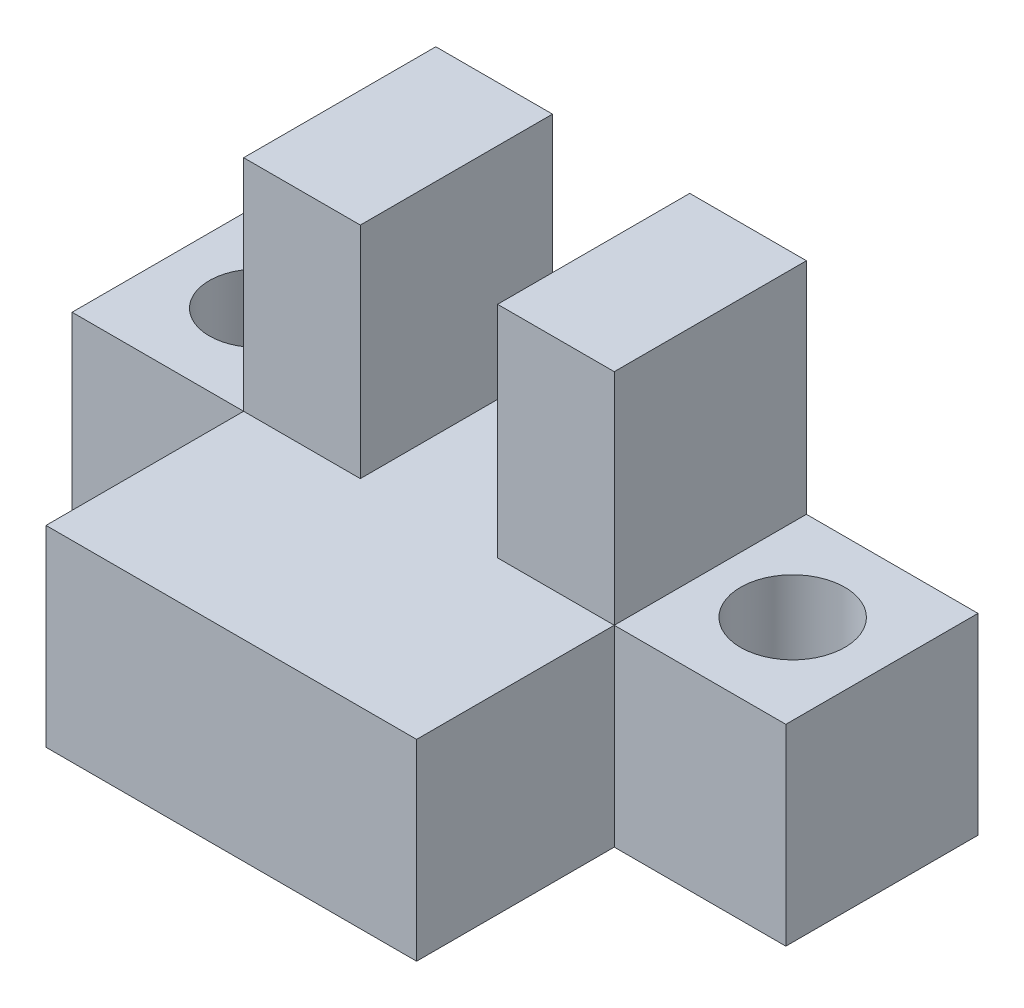
ISO-10303-21;
HEADER;
FILE_DESCRIPTION(('STEP AP214'),'2;1');
FILE_NAME('part.step','',(''),(''),'','','');
FILE_SCHEMA(('AUTOMOTIVE_DESIGN { 1 0 10303 214 1 1 1 1 }'));
ENDSEC;
DATA;
#1=APPLICATION_CONTEXT('core data for automotive mechanical design processes');
#2=APPLICATION_PROTOCOL_DEFINITION('international standard','automotive_design',2000,#1);
#3=PRODUCT_CONTEXT('',#1,'mechanical');
#4=PRODUCT('Part','Part','',(#3));
#5=PRODUCT_RELATED_PRODUCT_CATEGORY('part','',(#4));
#6=PRODUCT_DEFINITION_FORMATION('','',#4);
#7=PRODUCT_DEFINITION_CONTEXT('part definition',#1,'design');
#8=PRODUCT_DEFINITION('design','',#6,#7);
#9=PRODUCT_DEFINITION_SHAPE('','',#8);
#10=(LENGTH_UNIT() NAMED_UNIT(*) SI_UNIT(.MILLI.,.METRE.));
#11=(NAMED_UNIT(*) PLANE_ANGLE_UNIT() SI_UNIT($,.RADIAN.));
#12=(NAMED_UNIT(*) SI_UNIT($,.STERADIAN.) SOLID_ANGLE_UNIT());
#13=UNCERTAINTY_MEASURE_WITH_UNIT(LENGTH_MEASURE(1.E-05),#10,'distance_accuracy_value','');
#14=(GEOMETRIC_REPRESENTATION_CONTEXT(3) GLOBAL_UNCERTAINTY_ASSIGNED_CONTEXT((#13)) GLOBAL_UNIT_ASSIGNED_CONTEXT((#10,
#11,#12)) REPRESENTATION_CONTEXT('',''));
#15=CARTESIAN_POINT('',(0.,0.,0.));
#16=DIRECTION('',(0.,0.,1.));
#17=DIRECTION('',(1.,0.,0.));
#18=AXIS2_PLACEMENT_3D('',#15,#16,#17);
#19=CARTESIAN_POINT('',(0.,7.,0.));
#20=DIRECTION('',(0.,-1.,0.));
#21=DIRECTION('',(0.,0.,-1.));
#22=AXIS2_PLACEMENT_3D('',#19,#20,#21);
#23=PLANE('',#22);
#24=DIRECTION('',(0.,0.,1.));
#25=VECTOR('',#24,1.);
#26=CARTESIAN_POINT('',(15.5,7.,-14.2));
#27=LINE('',#26,#25);
#28=CARTESIAN_POINT('',(15.5,7.,-14.2));
#29=VERTEX_POINT('',#28);
#30=CARTESIAN_POINT('',(15.5,7.,-7.2));
#31=VERTEX_POINT('',#30);
#32=EDGE_CURVE('E168',#29,#31,#27,.T.);
#33=ORIENTED_EDGE('',*,*,#32,.F.);
#34=DIRECTION('',(-1.,0.,0.));
#35=VECTOR('',#34,1.);
#36=CARTESIAN_POINT('',(0.,7.,-14.2));
#37=LINE('',#36,#35);
#38=CARTESIAN_POINT('',(10.5,7.,-14.2));
#39=VERTEX_POINT('',#38);
#40=EDGE_CURVE('E211',#29,#39,#37,.T.);
#41=ORIENTED_EDGE('',*,*,#40,.T.);
#42=DIRECTION('',(0.,0.,-1.));
#43=VECTOR('',#42,1.);
#44=CARTESIAN_POINT('',(10.5,7.,-14.2));
#45=LINE('',#44,#43);
#46=CARTESIAN_POINT('',(10.5,7.,-7.2));
#47=VERTEX_POINT('',#46);
#48=EDGE_CURVE('E182',#47,#39,#45,.T.);
#49=ORIENTED_EDGE('',*,*,#48,.F.);
#50=DIRECTION('',(1.,0.,0.));
#51=VECTOR('',#50,1.);
#52=CARTESIAN_POINT('',(6.25,7.,-7.2));
#53=LINE('',#52,#51);
#54=CARTESIAN_POINT('',(6.25,7.,-7.2));
#55=VERTEX_POINT('',#54);
#56=EDGE_CURVE('E172',#55,#47,#53,.T.);
#57=ORIENTED_EDGE('',*,*,#56,.F.);
#58=DIRECTION('',(0.,0.,1.));
#59=VECTOR('',#58,1.);
#60=CARTESIAN_POINT('',(6.25,7.,0.));
#61=LINE('',#60,#59);
#62=CARTESIAN_POINT('',(6.25,7.,0.));
#63=VERTEX_POINT('',#62);
#64=EDGE_CURVE('E216',#55,#63,#61,.T.);
#65=ORIENTED_EDGE('',*,*,#64,.T.);
#66=DIRECTION('',(1.,0.,0.));
#67=VECTOR('',#66,1.);
#68=CARTESIAN_POINT('',(6.25,7.,0.));
#69=LINE('',#68,#67);
#70=CARTESIAN_POINT('',(19.75,7.,0.));
#71=VERTEX_POINT('',#70);
#72=EDGE_CURVE('E218',#63,#71,#69,.T.);
#73=ORIENTED_EDGE('',*,*,#72,.T.);
#74=DIRECTION('',(0.,0.,-1.));
#75=VECTOR('',#74,1.);
#76=CARTESIAN_POINT('',(19.75,7.,0.));
#77=LINE('',#76,#75);
#78=CARTESIAN_POINT('',(19.75,7.,-7.2));
#79=VERTEX_POINT('',#78);
#80=EDGE_CURVE('E220',#71,#79,#77,.T.);
#81=ORIENTED_EDGE('',*,*,#80,.T.);
#82=DIRECTION('',(1.,0.,0.));
#83=VECTOR('',#82,1.);
#84=CARTESIAN_POINT('',(15.5,7.,-7.2));
#85=LINE('',#84,#83);
#86=EDGE_CURVE('E52',#31,#79,#85,.T.);
#87=ORIENTED_EDGE('',*,*,#86,.F.);
#88=EDGE_LOOP('',(#33,#41,#49,#57,#65,#73,#81,#87));
#89=FACE_BOUND('',#88,.T.);
#90=ADVANCED_FACE('F35',(#89),#23,.F.);
#91=CARTESIAN_POINT('',(22.75,7.,-10.7));
#92=DIRECTION('',(0.,1.,0.));
#93=DIRECTION('',(0.,0.,1.));
#94=AXIS2_PLACEMENT_3D('',#91,#92,#93);
#95=CIRCLE('',#94,1.89947846464492);
#96=CARTESIAN_POINT('',(22.75,7.,-8.80052153535508));
#97=VERTEX_POINT('',#96);
#98=EDGE_CURVE('E265',#97,#97,#95,.T.);
#99=ORIENTED_EDGE('',*,*,#98,.F.);
#100=EDGE_LOOP('',(#99));
#101=FACE_BOUND('',#100,.T.);
#102=DIRECTION('',(0.,0.,-1.));
#103=VECTOR('',#102,1.);
#104=CARTESIAN_POINT('',(19.75,7.,-14.2));
#105=LINE('',#104,#103);
#106=CARTESIAN_POINT('',(19.75,7.,-14.2));
#107=VERTEX_POINT('',#106);
#108=EDGE_CURVE('E165',#79,#107,#105,.T.);
#109=ORIENTED_EDGE('',*,*,#108,.F.);
#110=DIRECTION('',(1.,0.,0.));
#111=VECTOR('',#110,1.);
#112=CARTESIAN_POINT('',(19.75,7.,-7.2));
#113=LINE('',#112,#111);
#114=CARTESIAN_POINT('',(26.,7.,-7.2));
#115=VERTEX_POINT('',#114);
#116=EDGE_CURVE('E222',#79,#115,#113,.T.);
#117=ORIENTED_EDGE('',*,*,#116,.T.);
#118=DIRECTION('',(0.,0.,-1.));
#119=VECTOR('',#118,1.);
#120=CARTESIAN_POINT('',(26.,7.,-7.2));
#121=LINE('',#120,#119);
#122=CARTESIAN_POINT('',(26.,7.,-14.2));
#123=VERTEX_POINT('',#122);
#124=EDGE_CURVE('E205',#115,#123,#121,.T.);
#125=ORIENTED_EDGE('',*,*,#124,.T.);
#126=EDGE_CURVE('E60',#123,#107,#37,.T.);
#127=ORIENTED_EDGE('',*,*,#126,.T.);
#128=EDGE_LOOP('',(#109,#117,#125,#127));
#129=FACE_BOUND('',#128,.T.);
#130=ADVANCED_FACE('F284',(#101,#129),#23,.F.);
#131=CARTESIAN_POINT('',(3.25,7.,-10.7));
#132=DIRECTION('',(0.,1.,0.));
#133=DIRECTION('',(0.,0.,1.));
#134=AXIS2_PLACEMENT_3D('',#131,#132,#133);
#135=CIRCLE('',#134,1.75);
#136=CARTESIAN_POINT('',(3.25,7.,-8.95));
#137=VERTEX_POINT('',#136);
#138=EDGE_CURVE('E260',#137,#137,#135,.T.);
#139=ORIENTED_EDGE('',*,*,#138,.F.);
#140=EDGE_LOOP('',(#139));
#141=FACE_BOUND('',#140,.T.);
#142=DIRECTION('',(0.,0.,1.));
#143=VECTOR('',#142,1.);
#144=CARTESIAN_POINT('',(6.25,7.,-14.2));
#145=LINE('',#144,#143);
#146=CARTESIAN_POINT('',(6.25,7.,-14.2));
#147=VERTEX_POINT('',#146);
#148=EDGE_CURVE('E169',#147,#55,#145,.T.);
#149=ORIENTED_EDGE('',*,*,#148,.F.);
#150=CARTESIAN_POINT('',(0.,7.,-14.2));
#151=VERTEX_POINT('',#150);
#152=EDGE_CURVE('E207',#147,#151,#37,.T.);
#153=ORIENTED_EDGE('',*,*,#152,.T.);
#154=DIRECTION('',(0.,0.,1.));
#155=VECTOR('',#154,1.);
#156=CARTESIAN_POINT('',(0.,7.,-7.2));
#157=LINE('',#156,#155);
#158=CARTESIAN_POINT('',(0.,7.,-7.2));
#159=VERTEX_POINT('',#158);
#160=EDGE_CURVE('E210',#151,#159,#157,.T.);
#161=ORIENTED_EDGE('',*,*,#160,.T.);
#162=DIRECTION('',(1.,0.,0.));
#163=VECTOR('',#162,1.);
#164=CARTESIAN_POINT('',(0.,7.,-7.2));
#165=LINE('',#164,#163);
#166=EDGE_CURVE('E213',#159,#55,#165,.T.);
#167=ORIENTED_EDGE('',*,*,#166,.T.);
#168=EDGE_LOOP('',(#149,#153,#161,#167));
#169=FACE_BOUND('',#168,.T.);
#170=ADVANCED_FACE('F330',(#141,#169),#23,.F.);
#171=CARTESIAN_POINT('',(26.,7.,-7.2));
#172=DIRECTION('',(-1.,0.,0.));
#173=DIRECTION('',(0.,0.,1.));
#174=AXIS2_PLACEMENT_3D('',#171,#172,#173);
#175=PLANE('',#174);
#176=DIRECTION('',(0.,0.,-1.));
#177=VECTOR('',#176,1.);
#178=CARTESIAN_POINT('',(26.,0.,-7.2));
#179=LINE('',#178,#177);
#180=CARTESIAN_POINT('',(26.,0.,-7.2));
#181=VERTEX_POINT('',#180);
#182=CARTESIAN_POINT('',(26.,0.,-14.2));
#183=VERTEX_POINT('',#182);
#184=EDGE_CURVE('E204',#181,#183,#179,.T.);
#185=ORIENTED_EDGE('',*,*,#184,.T.);
#186=DIRECTION('',(0.,-1.,0.));
#187=VECTOR('',#186,1.);
#188=CARTESIAN_POINT('',(26.,7.,-14.2));
#189=LINE('',#188,#187);
#190=EDGE_CURVE('E11',#123,#183,#189,.T.);
#191=ORIENTED_EDGE('',*,*,#190,.F.);
#192=ORIENTED_EDGE('',*,*,#124,.F.);
#193=DIRECTION('',(0.,-1.,0.));
#194=VECTOR('',#193,1.);
#195=CARTESIAN_POINT('',(26.,7.,-7.2));
#196=LINE('',#195,#194);
#197=EDGE_CURVE('E224',#115,#181,#196,.T.);
#198=ORIENTED_EDGE('',*,*,#197,.T.);
#199=EDGE_LOOP('',(#185,#191,#192,#198));
#200=FACE_BOUND('',#199,.T.);
#201=ADVANCED_FACE('F37',(#200),#175,.F.);
#202=CARTESIAN_POINT('',(0.,7.,-14.2));
#203=DIRECTION('',(0.,0.,1.));
#204=DIRECTION('',(1.,0.,0.));
#205=AXIS2_PLACEMENT_3D('',#202,#203,#204);
#206=PLANE('',#205);
#207=DIRECTION('',(-1.,0.,0.));
#208=VECTOR('',#207,1.);
#209=CARTESIAN_POINT('',(0.,0.,-14.2));
#210=LINE('',#209,#208);
#211=CARTESIAN_POINT('',(0.,0.,-14.2));
#212=VERTEX_POINT('',#211);
#213=EDGE_CURVE('E227',#183,#212,#210,.T.);
#214=ORIENTED_EDGE('',*,*,#213,.T.);
#215=DIRECTION('',(0.,-1.,0.));
#216=VECTOR('',#215,1.);
#217=CARTESIAN_POINT('',(0.,7.,-14.2));
#218=LINE('',#217,#216);
#219=EDGE_CURVE('E44',#151,#212,#218,.T.);
#220=ORIENTED_EDGE('',*,*,#219,.F.);
#221=ORIENTED_EDGE('',*,*,#152,.F.);
#222=DIRECTION('',(0.,-1.,0.));
#223=VECTOR('',#222,1.);
#224=CARTESIAN_POINT('',(6.25,15.,-14.2));
#225=LINE('',#224,#223);
#226=CARTESIAN_POINT('',(6.25,15.,-14.2));
#227=VERTEX_POINT('',#226);
#228=EDGE_CURVE('E187',#227,#147,#225,.T.);
#229=ORIENTED_EDGE('',*,*,#228,.F.);
#230=DIRECTION('',(-1.,0.,0.));
#231=VECTOR('',#230,1.);
#232=CARTESIAN_POINT('',(6.25,15.,-14.2));
#233=LINE('',#232,#231);
#234=CARTESIAN_POINT('',(10.5,15.,-14.2));
#235=VERTEX_POINT('',#234);
#236=EDGE_CURVE('E186',#235,#227,#233,.T.);
#237=ORIENTED_EDGE('',*,*,#236,.F.);
#238=DIRECTION('',(0.,-1.,0.));
#239=VECTOR('',#238,1.);
#240=CARTESIAN_POINT('',(10.5,15.,-14.2));
#241=LINE('',#240,#239);
#242=EDGE_CURVE('E195',#235,#39,#241,.T.);
#243=ORIENTED_EDGE('',*,*,#242,.T.);
#244=ORIENTED_EDGE('',*,*,#40,.F.);
#245=DIRECTION('',(0.,-1.,0.));
#246=VECTOR('',#245,1.);
#247=CARTESIAN_POINT('',(15.5,15.,-14.2));
#248=LINE('',#247,#246);
#249=CARTESIAN_POINT('',(15.5,15.,-14.2));
#250=VERTEX_POINT('',#249);
#251=EDGE_CURVE('E274',#250,#29,#248,.T.);
#252=ORIENTED_EDGE('',*,*,#251,.F.);
#253=DIRECTION('',(-1.,0.,0.));
#254=VECTOR('',#253,1.);
#255=CARTESIAN_POINT('',(15.5,15.,-14.2));
#256=LINE('',#255,#254);
#257=CARTESIAN_POINT('',(19.75,15.,-14.2));
#258=VERTEX_POINT('',#257);
#259=EDGE_CURVE('E161',#258,#250,#256,.T.);
#260=ORIENTED_EDGE('',*,*,#259,.F.);
#261=DIRECTION('',(0.,-1.,0.));
#262=VECTOR('',#261,1.);
#263=CARTESIAN_POINT('',(19.75,15.,-14.2));
#264=LINE('',#263,#262);
#265=EDGE_CURVE('E174',#258,#107,#264,.T.);
#266=ORIENTED_EDGE('',*,*,#265,.T.);
#267=ORIENTED_EDGE('',*,*,#126,.F.);
#268=ORIENTED_EDGE('',*,*,#190,.T.);
#269=EDGE_LOOP('',(#214,#220,#221,#229,#237,#243,#244,#252,#260,#266,#267,#268));
#270=FACE_BOUND('',#269,.T.);
#271=ADVANCED_FACE('F281',(#270),#206,.F.);
#272=CARTESIAN_POINT('',(0.,7.,-7.2));
#273=DIRECTION('',(1.,0.,0.));
#274=DIRECTION('',(0.,0.,-1.));
#275=AXIS2_PLACEMENT_3D('',#272,#273,#274);
#276=PLANE('',#275);
#277=DIRECTION('',(0.,0.,1.));
#278=VECTOR('',#277,1.);
#279=CARTESIAN_POINT('',(0.,0.,-7.2));
#280=LINE('',#279,#278);
#281=CARTESIAN_POINT('',(0.,0.,-7.2));
#282=VERTEX_POINT('',#281);
#283=EDGE_CURVE('E229',#212,#282,#280,.T.);
#284=ORIENTED_EDGE('',*,*,#283,.T.);
#285=DIRECTION('',(0.,-1.,0.));
#286=VECTOR('',#285,1.);
#287=CARTESIAN_POINT('',(0.,7.,-7.2));
#288=LINE('',#287,#286);
#289=EDGE_CURVE('E254',#159,#282,#288,.T.);
#290=ORIENTED_EDGE('',*,*,#289,.F.);
#291=ORIENTED_EDGE('',*,*,#160,.F.);
#292=ORIENTED_EDGE('',*,*,#219,.T.);
#293=EDGE_LOOP('',(#284,#290,#291,#292));
#294=FACE_BOUND('',#293,.T.);
#295=ADVANCED_FACE('F307',(#294),#276,.F.);
#296=CARTESIAN_POINT('',(0.,7.,-7.2));
#297=DIRECTION('',(0.,0.,-1.));
#298=DIRECTION('',(-1.,0.,0.));
#299=AXIS2_PLACEMENT_3D('',#296,#297,#298);
#300=PLANE('',#299);
#301=DIRECTION('',(1.,0.,0.));
#302=VECTOR('',#301,1.);
#303=CARTESIAN_POINT('',(0.,0.,-7.2));
#304=LINE('',#303,#302);
#305=CARTESIAN_POINT('',(6.25,0.,-7.2));
#306=VERTEX_POINT('',#305);
#307=EDGE_CURVE('E231',#282,#306,#304,.T.);
#308=ORIENTED_EDGE('',*,*,#307,.T.);
#309=DIRECTION('',(0.,-1.,0.));
#310=VECTOR('',#309,1.);
#311=CARTESIAN_POINT('',(6.25,7.,-7.2));
#312=LINE('',#311,#310);
#313=EDGE_CURVE('E251',#55,#306,#312,.T.);
#314=ORIENTED_EDGE('',*,*,#313,.F.);
#315=ORIENTED_EDGE('',*,*,#166,.F.);
#316=ORIENTED_EDGE('',*,*,#289,.T.);
#317=EDGE_LOOP('',(#308,#314,#315,#316));
#318=FACE_BOUND('',#317,.T.);
#319=ADVANCED_FACE('F315',(#318),#300,.F.);
#320=CARTESIAN_POINT('',(6.25,7.,0.));
#321=DIRECTION('',(1.,0.,0.));
#322=DIRECTION('',(0.,0.,-1.));
#323=AXIS2_PLACEMENT_3D('',#320,#321,#322);
#324=PLANE('',#323);
#325=DIRECTION('',(0.,0.,1.));
#326=VECTOR('',#325,1.);
#327=CARTESIAN_POINT('',(6.25,0.,0.));
#328=LINE('',#327,#326);
#329=CARTESIAN_POINT('',(6.25,0.,0.));
#330=VERTEX_POINT('',#329);
#331=EDGE_CURVE('E233',#306,#330,#328,.T.);
#332=ORIENTED_EDGE('',*,*,#331,.T.);
#333=DIRECTION('',(0.,-1.,0.));
#334=VECTOR('',#333,1.);
#335=CARTESIAN_POINT('',(6.25,7.,0.));
#336=LINE('',#335,#334);
#337=EDGE_CURVE('E248',#63,#330,#336,.T.);
#338=ORIENTED_EDGE('',*,*,#337,.F.);
#339=ORIENTED_EDGE('',*,*,#64,.F.);
#340=ORIENTED_EDGE('',*,*,#313,.T.);
#341=EDGE_LOOP('',(#332,#338,#339,#340));
#342=FACE_BOUND('',#341,.T.);
#343=ADVANCED_FACE('F319',(#342),#324,.F.);
#344=CARTESIAN_POINT('',(6.25,7.,0.));
#345=DIRECTION('',(0.,0.,-1.));
#346=DIRECTION('',(-1.,0.,0.));
#347=AXIS2_PLACEMENT_3D('',#344,#345,#346);
#348=PLANE('',#347);
#349=DIRECTION('',(1.,0.,0.));
#350=VECTOR('',#349,1.);
#351=CARTESIAN_POINT('',(6.25,0.,0.));
#352=LINE('',#351,#350);
#353=CARTESIAN_POINT('',(19.75,0.,0.));
#354=VERTEX_POINT('',#353);
#355=EDGE_CURVE('E235',#330,#354,#352,.T.);
#356=ORIENTED_EDGE('',*,*,#355,.T.);
#357=DIRECTION('',(0.,-1.,0.));
#358=VECTOR('',#357,1.);
#359=CARTESIAN_POINT('',(19.75,7.,0.));
#360=LINE('',#359,#358);
#361=EDGE_CURVE('E245',#71,#354,#360,.T.);
#362=ORIENTED_EDGE('',*,*,#361,.F.);
#363=ORIENTED_EDGE('',*,*,#72,.F.);
#364=ORIENTED_EDGE('',*,*,#337,.T.);
#365=EDGE_LOOP('',(#356,#362,#363,#364));
#366=FACE_BOUND('',#365,.T.);
#367=ADVANCED_FACE('F371',(#366),#348,.F.);
#368=CARTESIAN_POINT('',(19.75,7.,0.));
#369=DIRECTION('',(-1.,0.,0.));
#370=DIRECTION('',(0.,0.,1.));
#371=AXIS2_PLACEMENT_3D('',#368,#369,#370);
#372=PLANE('',#371);
#373=DIRECTION('',(0.,0.,-1.));
#374=VECTOR('',#373,1.);
#375=CARTESIAN_POINT('',(19.75,0.,0.));
#376=LINE('',#375,#374);
#377=CARTESIAN_POINT('',(19.75,0.,-7.2));
#378=VERTEX_POINT('',#377);
#379=EDGE_CURVE('E237',#354,#378,#376,.T.);
#380=ORIENTED_EDGE('',*,*,#379,.T.);
#381=DIRECTION('',(0.,-1.,0.));
#382=VECTOR('',#381,1.);
#383=CARTESIAN_POINT('',(19.75,7.,-7.2));
#384=LINE('',#383,#382);
#385=EDGE_CURVE('E242',#79,#378,#384,.T.);
#386=ORIENTED_EDGE('',*,*,#385,.F.);
#387=ORIENTED_EDGE('',*,*,#80,.F.);
#388=ORIENTED_EDGE('',*,*,#361,.T.);
#389=EDGE_LOOP('',(#380,#386,#387,#388));
#390=FACE_BOUND('',#389,.T.);
#391=ADVANCED_FACE('F292',(#390),#372,.F.);
#392=CARTESIAN_POINT('',(19.75,7.,-7.2));
#393=DIRECTION('',(0.,0.,-1.));
#394=DIRECTION('',(-1.,0.,0.));
#395=AXIS2_PLACEMENT_3D('',#392,#393,#394);
#396=PLANE('',#395);
#397=DIRECTION('',(1.,0.,0.));
#398=VECTOR('',#397,1.);
#399=CARTESIAN_POINT('',(19.75,0.,-7.2));
#400=LINE('',#399,#398);
#401=EDGE_CURVE('E208',#378,#181,#400,.T.);
#402=ORIENTED_EDGE('',*,*,#401,.T.);
#403=ORIENTED_EDGE('',*,*,#197,.F.);
#404=ORIENTED_EDGE('',*,*,#116,.F.);
#405=ORIENTED_EDGE('',*,*,#385,.T.);
#406=EDGE_LOOP('',(#402,#403,#404,#405));
#407=FACE_BOUND('',#406,.T.);
#408=ADVANCED_FACE('F296',(#407),#396,.F.);
#409=CARTESIAN_POINT('',(0.,0.,0.));
#410=DIRECTION('',(0.,-1.,0.));
#411=DIRECTION('',(0.,0.,-1.));
#412=AXIS2_PLACEMENT_3D('',#409,#410,#411);
#413=PLANE('',#412);
#414=CARTESIAN_POINT('',(3.25,0.,-10.7));
#415=DIRECTION('',(0.,-1.,0.));
#416=DIRECTION('',(0.,0.,-1.));
#417=AXIS2_PLACEMENT_3D('',#414,#415,#416);
#418=CIRCLE('',#417,1.75);
#419=CARTESIAN_POINT('',(3.25,0.,-12.45));
#420=VERTEX_POINT('',#419);
#421=EDGE_CURVE('E39',#420,#420,#418,.T.);
#422=ORIENTED_EDGE('',*,*,#421,.F.);
#423=EDGE_LOOP('',(#422));
#424=FACE_BOUND('',#423,.T.);
#425=CARTESIAN_POINT('',(22.75,0.,-10.7));
#426=DIRECTION('',(0.,-1.,0.));
#427=DIRECTION('',(0.,0.,-1.));
#428=AXIS2_PLACEMENT_3D('',#425,#426,#427);
#429=CIRCLE('',#428,1.89947846464492);
#430=CARTESIAN_POINT('',(22.75,0.,-12.5994784646449));
#431=VERTEX_POINT('',#430);
#432=EDGE_CURVE('E258',#431,#431,#429,.T.);
#433=ORIENTED_EDGE('',*,*,#432,.F.);
#434=EDGE_LOOP('',(#433));
#435=FACE_BOUND('',#434,.T.);
#436=ORIENTED_EDGE('',*,*,#184,.F.);
#437=ORIENTED_EDGE('',*,*,#401,.F.);
#438=ORIENTED_EDGE('',*,*,#379,.F.);
#439=ORIENTED_EDGE('',*,*,#355,.F.);
#440=ORIENTED_EDGE('',*,*,#331,.F.);
#441=ORIENTED_EDGE('',*,*,#307,.F.);
#442=ORIENTED_EDGE('',*,*,#283,.F.);
#443=ORIENTED_EDGE('',*,*,#213,.F.);
#444=EDGE_LOOP('',(#436,#437,#438,#439,#440,#441,#442,#443));
#445=FACE_BOUND('',#444,.T.);
#446=ADVANCED_FACE('F310',(#424,#435,#445),#413,.T.);
#447=CARTESIAN_POINT('',(6.25,15.,-14.2));
#448=DIRECTION('',(1.,0.,0.));
#449=DIRECTION('',(0.,0.,-1.));
#450=AXIS2_PLACEMENT_3D('',#447,#448,#449);
#451=PLANE('',#450);
#452=ORIENTED_EDGE('',*,*,#148,.T.);
#453=DIRECTION('',(0.,-1.,0.));
#454=VECTOR('',#453,1.);
#455=CARTESIAN_POINT('',(6.25,15.,-7.2));
#456=LINE('',#455,#454);
#457=CARTESIAN_POINT('',(6.25,15.,-7.2));
#458=VERTEX_POINT('',#457);
#459=EDGE_CURVE('E201',#458,#55,#456,.T.);
#460=ORIENTED_EDGE('',*,*,#459,.F.);
#461=DIRECTION('',(0.,0.,1.));
#462=VECTOR('',#461,1.);
#463=CARTESIAN_POINT('',(6.25,15.,-14.2));
#464=LINE('',#463,#462);
#465=EDGE_CURVE('E178',#227,#458,#464,.T.);
#466=ORIENTED_EDGE('',*,*,#465,.F.);
#467=ORIENTED_EDGE('',*,*,#228,.T.);
#468=EDGE_LOOP('',(#452,#460,#466,#467));
#469=FACE_BOUND('',#468,.T.);
#470=ADVANCED_FACE('F327',(#469),#451,.F.);
#471=CARTESIAN_POINT('',(6.25,15.,-7.2));
#472=DIRECTION('',(0.,0.,-1.));
#473=DIRECTION('',(-1.,0.,0.));
#474=AXIS2_PLACEMENT_3D('',#471,#472,#473);
#475=PLANE('',#474);
#476=ORIENTED_EDGE('',*,*,#56,.T.);
#477=DIRECTION('',(0.,-1.,0.));
#478=VECTOR('',#477,1.);
#479=CARTESIAN_POINT('',(10.5,15.,-7.2));
#480=LINE('',#479,#478);
#481=CARTESIAN_POINT('',(10.5,15.,-7.2));
#482=VERTEX_POINT('',#481);
#483=EDGE_CURVE('E198',#482,#47,#480,.T.);
#484=ORIENTED_EDGE('',*,*,#483,.F.);
#485=DIRECTION('',(1.,0.,0.));
#486=VECTOR('',#485,1.);
#487=CARTESIAN_POINT('',(6.25,15.,-7.2));
#488=LINE('',#487,#486);
#489=EDGE_CURVE('E181',#458,#482,#488,.T.);
#490=ORIENTED_EDGE('',*,*,#489,.F.);
#491=ORIENTED_EDGE('',*,*,#459,.T.);
#492=EDGE_LOOP('',(#476,#484,#490,#491));
#493=FACE_BOUND('',#492,.T.);
#494=ADVANCED_FACE('F323',(#493),#475,.F.);
#495=CARTESIAN_POINT('',(10.5,15.,-14.2));
#496=DIRECTION('',(-1.,0.,0.));
#497=DIRECTION('',(0.,0.,1.));
#498=AXIS2_PLACEMENT_3D('',#495,#496,#497);
#499=PLANE('',#498);
#500=ORIENTED_EDGE('',*,*,#48,.T.);
#501=ORIENTED_EDGE('',*,*,#242,.F.);
#502=DIRECTION('',(0.,0.,-1.));
#503=VECTOR('',#502,1.);
#504=CARTESIAN_POINT('',(10.5,15.,-14.2));
#505=LINE('',#504,#503);
#506=EDGE_CURVE('E184',#482,#235,#505,.T.);
#507=ORIENTED_EDGE('',*,*,#506,.F.);
#508=ORIENTED_EDGE('',*,*,#483,.T.);
#509=EDGE_LOOP('',(#500,#501,#507,#508));
#510=FACE_BOUND('',#509,.T.);
#511=ADVANCED_FACE('F334',(#510),#499,.F.);
#512=CARTESIAN_POINT('',(0.,15.,0.));
#513=DIRECTION('',(0.,1.,0.));
#514=DIRECTION('',(0.,0.,1.));
#515=AXIS2_PLACEMENT_3D('',#512,#513,#514);
#516=PLANE('',#515);
#517=ORIENTED_EDGE('',*,*,#465,.T.);
#518=ORIENTED_EDGE('',*,*,#489,.T.);
#519=ORIENTED_EDGE('',*,*,#506,.T.);
#520=ORIENTED_EDGE('',*,*,#236,.T.);
#521=EDGE_LOOP('',(#517,#518,#519,#520));
#522=FACE_BOUND('',#521,.T.);
#523=ADVANCED_FACE('F337',(#522),#516,.T.);
#524=CARTESIAN_POINT('',(15.5,15.,-14.2));
#525=DIRECTION('',(1.,0.,0.));
#526=DIRECTION('',(0.,0.,-1.));
#527=AXIS2_PLACEMENT_3D('',#524,#525,#526);
#528=PLANE('',#527);
#529=ORIENTED_EDGE('',*,*,#32,.T.);
#530=DIRECTION('',(0.,-1.,0.));
#531=VECTOR('',#530,1.);
#532=CARTESIAN_POINT('',(15.5,15.,-7.2));
#533=LINE('',#532,#531);
#534=CARTESIAN_POINT('',(15.5,15.,-7.2));
#535=VERTEX_POINT('',#534);
#536=EDGE_CURVE('E149',#535,#31,#533,.T.);
#537=ORIENTED_EDGE('',*,*,#536,.F.);
#538=DIRECTION('',(0.,0.,1.));
#539=VECTOR('',#538,1.);
#540=CARTESIAN_POINT('',(15.5,15.,-14.2));
#541=LINE('',#540,#539);
#542=EDGE_CURVE('E156',#250,#535,#541,.T.);
#543=ORIENTED_EDGE('',*,*,#542,.F.);
#544=ORIENTED_EDGE('',*,*,#251,.T.);
#545=EDGE_LOOP('',(#529,#537,#543,#544));
#546=FACE_BOUND('',#545,.T.);
#547=ADVANCED_FACE('F167',(#546),#528,.F.);
#548=CARTESIAN_POINT('',(15.5,15.,-7.2));
#549=DIRECTION('',(0.,0.,-1.));
#550=DIRECTION('',(-1.,0.,0.));
#551=AXIS2_PLACEMENT_3D('',#548,#549,#550);
#552=PLANE('',#551);
#553=ORIENTED_EDGE('',*,*,#86,.T.);
#554=DIRECTION('',(0.,-1.,0.));
#555=VECTOR('',#554,1.);
#556=CARTESIAN_POINT('',(19.75,15.,-7.2));
#557=LINE('',#556,#555);
#558=CARTESIAN_POINT('',(19.75,15.,-7.2));
#559=VERTEX_POINT('',#558);
#560=EDGE_CURVE('E152',#559,#79,#557,.T.);
#561=ORIENTED_EDGE('',*,*,#560,.F.);
#562=DIRECTION('',(1.,0.,0.));
#563=VECTOR('',#562,1.);
#564=CARTESIAN_POINT('',(15.5,15.,-7.2));
#565=LINE('',#564,#563);
#566=EDGE_CURVE('E145',#535,#559,#565,.T.);
#567=ORIENTED_EDGE('',*,*,#566,.F.);
#568=ORIENTED_EDGE('',*,*,#536,.T.);
#569=EDGE_LOOP('',(#553,#561,#567,#568));
#570=FACE_BOUND('',#569,.T.);
#571=ADVANCED_FACE('F147',(#570),#552,.F.);
#572=CARTESIAN_POINT('',(19.75,15.,-14.2));
#573=DIRECTION('',(-1.,0.,0.));
#574=DIRECTION('',(0.,0.,1.));
#575=AXIS2_PLACEMENT_3D('',#572,#573,#574);
#576=PLANE('',#575);
#577=ORIENTED_EDGE('',*,*,#108,.T.);
#578=ORIENTED_EDGE('',*,*,#265,.F.);
#579=DIRECTION('',(0.,0.,-1.));
#580=VECTOR('',#579,1.);
#581=CARTESIAN_POINT('',(19.75,15.,-14.2));
#582=LINE('',#581,#580);
#583=EDGE_CURVE('E155',#559,#258,#582,.T.);
#584=ORIENTED_EDGE('',*,*,#583,.F.);
#585=ORIENTED_EDGE('',*,*,#560,.T.);
#586=EDGE_LOOP('',(#577,#578,#584,#585));
#587=FACE_BOUND('',#586,.T.);
#588=ADVANCED_FACE('F283',(#587),#576,.F.);
#589=CARTESIAN_POINT('',(0.,15.,0.));
#590=DIRECTION('',(0.,1.,0.));
#591=DIRECTION('',(0.,0.,1.));
#592=AXIS2_PLACEMENT_3D('',#589,#590,#591);
#593=PLANE('',#592);
#594=ORIENTED_EDGE('',*,*,#542,.T.);
#595=ORIENTED_EDGE('',*,*,#566,.T.);
#596=ORIENTED_EDGE('',*,*,#583,.T.);
#597=ORIENTED_EDGE('',*,*,#259,.T.);
#598=EDGE_LOOP('',(#594,#595,#596,#597));
#599=FACE_BOUND('',#598,.T.);
#600=ADVANCED_FACE('F159',(#599),#593,.T.);
#601=CARTESIAN_POINT('',(22.75,-12.,-10.7));
#602=DIRECTION('',(0.,1.,0.));
#603=DIRECTION('',(0.,0.,1.));
#604=AXIS2_PLACEMENT_3D('',#601,#602,#603);
#605=CYLINDRICAL_SURFACE('',#604,1.89947846464492);
#606=ORIENTED_EDGE('',*,*,#432,.T.);
#607=EDGE_LOOP('',(#606));
#608=FACE_BOUND('',#607,.T.);
#609=ORIENTED_EDGE('',*,*,#98,.T.);
#610=EDGE_LOOP('',(#609));
#611=FACE_BOUND('',#610,.T.);
#612=ADVANCED_FACE('F388',(#608,#611),#605,.F.);
#613=CARTESIAN_POINT('',(3.25,-12.,-10.7));
#614=DIRECTION('',(0.,1.,0.));
#615=DIRECTION('',(0.,0.,1.));
#616=AXIS2_PLACEMENT_3D('',#613,#614,#615);
#617=CYLINDRICAL_SURFACE('',#616,1.75);
#618=ORIENTED_EDGE('',*,*,#421,.T.);
#619=EDGE_LOOP('',(#618));
#620=FACE_BOUND('',#619,.T.);
#621=ORIENTED_EDGE('',*,*,#138,.T.);
#622=EDGE_LOOP('',(#621));
#623=FACE_BOUND('',#622,.T.);
#624=ADVANCED_FACE('F386',(#620,#623),#617,.F.);
#625=CLOSED_SHELL('',(#90,#130,#170,#201,#271,#295,#319,#343,#367,#391,#408,#446,#470,#494,#511,
#523,#547,#571,#588,#600,#612,#624));
#626=MANIFOLD_SOLID_BREP('B2',#625);
#627=ADVANCED_BREP_SHAPE_REPRESENTATION('',(#18,#626),#14);
#628=SHAPE_DEFINITION_REPRESENTATION(#9,#627);
ENDSEC;
END-ISO-10303-21;
